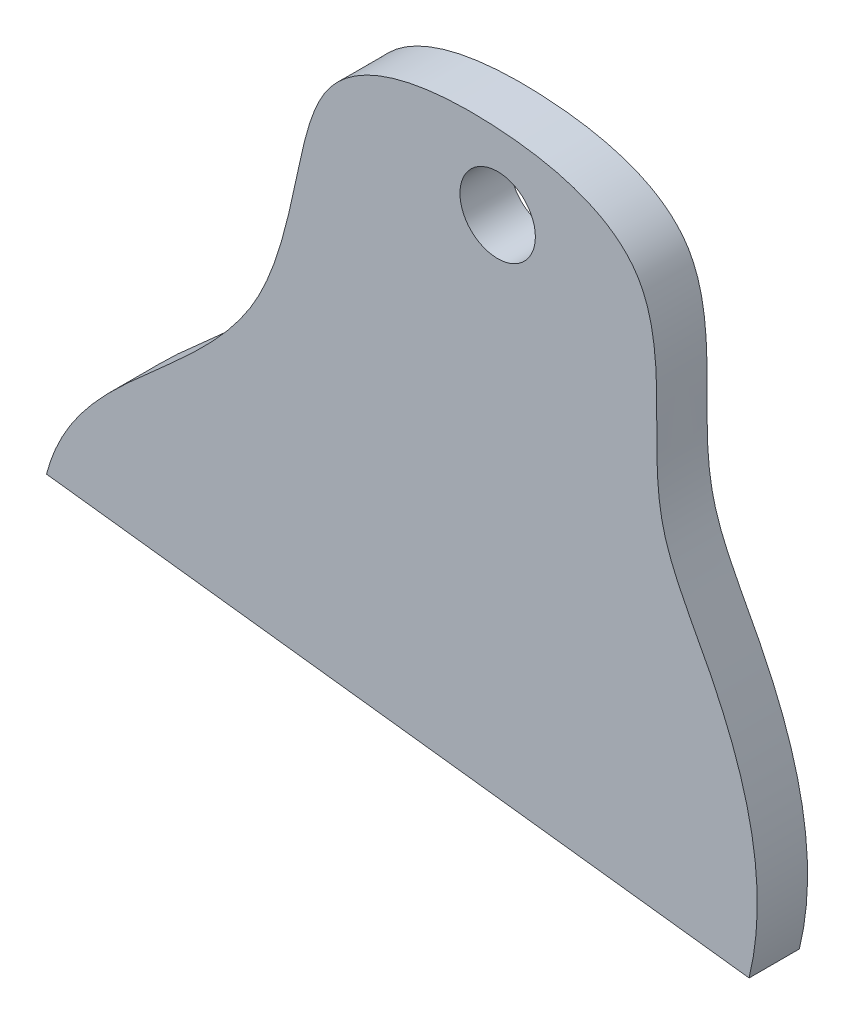
ISO-10303-21;
HEADER;
FILE_DESCRIPTION(('STEP AP214'),'2;1');
FILE_NAME('part.step','',(''),(''),'','','');
FILE_SCHEMA(('AUTOMOTIVE_DESIGN { 1 0 10303 214 1 1 1 1 }'));
ENDSEC;
DATA;
#1=APPLICATION_CONTEXT('core data for automotive mechanical design processes');
#2=APPLICATION_PROTOCOL_DEFINITION('international standard','automotive_design',2000,#1);
#3=PRODUCT_CONTEXT('',#1,'mechanical');
#4=PRODUCT('Part','Part','',(#3));
#5=PRODUCT_RELATED_PRODUCT_CATEGORY('part','',(#4));
#6=PRODUCT_DEFINITION_FORMATION('','',#4);
#7=PRODUCT_DEFINITION_CONTEXT('part definition',#1,'design');
#8=PRODUCT_DEFINITION('design','',#6,#7);
#9=PRODUCT_DEFINITION_SHAPE('','',#8);
#10=(LENGTH_UNIT() NAMED_UNIT(*) SI_UNIT(.MILLI.,.METRE.));
#11=(NAMED_UNIT(*) PLANE_ANGLE_UNIT() SI_UNIT($,.RADIAN.));
#12=(NAMED_UNIT(*) SI_UNIT($,.STERADIAN.) SOLID_ANGLE_UNIT());
#13=UNCERTAINTY_MEASURE_WITH_UNIT(LENGTH_MEASURE(1.E-05),#10,'distance_accuracy_value','');
#14=(GEOMETRIC_REPRESENTATION_CONTEXT(3) GLOBAL_UNCERTAINTY_ASSIGNED_CONTEXT((#13)) GLOBAL_UNIT_ASSIGNED_CONTEXT((#10,
#11,#12)) REPRESENTATION_CONTEXT('',''));
#15=CARTESIAN_POINT('',(0.,0.,0.));
#16=DIRECTION('',(0.,0.,1.));
#17=DIRECTION('',(1.,0.,0.));
#18=AXIS2_PLACEMENT_3D('',#15,#16,#17);
#19=CARTESIAN_POINT('',(196.885519600877,73.5197835961627,3.73352057061736));
#20=DIRECTION('',(0.,0.,1.));
#21=DIRECTION('',(1.,0.,0.));
#22=AXIS2_PLACEMENT_3D('',#19,#20,#21);
#23=PLANE('',#22);
#24=CARTESIAN_POINT('',(197.524201168025,68.7425599889752,3.73352057061736));
#25=DIRECTION('',(0.,0.,1.));
#26=DIRECTION('',(1.,0.,0.));
#27=AXIS2_PLACEMENT_3D('',#24,#25,#26);
#28=CIRCLE('',#27,2.38125);
#29=CARTESIAN_POINT('',(199.905451168025,68.7425599889752,3.73352057061736));
#30=VERTEX_POINT('',#29);
#31=EDGE_CURVE('E75',#30,#30,#28,.T.);
#32=ORIENTED_EDGE('',*,*,#31,.F.);
#33=EDGE_LOOP('',(#32));
#34=FACE_BOUND('',#33,.T.);
#35=CARTESIAN_POINT('',(213.398522317962,34.9678420457756,3.73352057061736));
#36=CARTESIAN_POINT('',(214.739425340125,40.5202417322655,3.73352057061736));
#37=CARTESIAN_POINT('',(212.727112535516,47.9078385286961,3.73352057061736));
#38=CARTESIAN_POINT('',(207.222282090085,56.7821358552539,3.73352057061736));
#39=CARTESIAN_POINT('',(207.778211380204,63.4368924721874,3.73352057061736));
#40=CARTESIAN_POINT('',(206.989400577675,71.7335959398961,3.73352057061736));
#41=CARTESIAN_POINT('',(196.992788874341,74.3612933869673,3.73352057061736));
#42=CARTESIAN_POINT('',(186.590416887325,72.7052604967253,3.73352057061736));
#43=CARTESIAN_POINT('',(184.658232764424,63.61418970115,3.73352057061736));
#44=CARTESIAN_POINT('',(183.082647038621,56.3219629705471,3.73352057061736));
#45=CARTESIAN_POINT('',(175.887019226226,49.0789156728427,3.73352057061736));
#46=CARTESIAN_POINT('',(170.220244557908,44.8785204542336,3.73352057061736));
#47=CARTESIAN_POINT('',(169.043801457843,40.3370977288428,3.73352057061736));
#48=B_SPLINE_CURVE_WITH_KNOTS('',3,(#35,#36,#37,#38,#39,#40,#41,#42,#43,#44,#45,#46,#47),
.UNSPECIFIED.,.F.,.F.,(4,1,1,1,1,1,1,1,1,1,4),(0.,0.174395650753758,0.246774344616884,
0.327814520097947,0.389778749260922,0.493993279713233,0.615527262475496,0.677077702508021,
0.775393493905345,0.855998922563102,1.),.UNSPECIFIED.);
#49=CARTESIAN_POINT('',(213.398522317962,34.9678420457756,3.73352057061736));
#50=VERTEX_POINT('',#49);
#51=CARTESIAN_POINT('',(169.043801457843,40.3370977288428,3.73352057061736));
#52=VERTEX_POINT('',#51);
#53=EDGE_CURVE('E67',#50,#52,#48,.T.);
#54=ORIENTED_EDGE('',*,*,#53,.T.);
#55=DIRECTION('',(0.992752683848461,-0.120175324886919,0.));
#56=VECTOR('',#55,1.);
#57=CARTESIAN_POINT('',(169.043801457843,40.3370977288428,3.73352057061736));
#58=LINE('',#57,#56);
#59=EDGE_CURVE('E52',#52,#50,#58,.T.);
#60=ORIENTED_EDGE('',*,*,#59,.T.);
#61=EDGE_LOOP('',(#54,#60));
#62=FACE_BOUND('',#61,.T.);
#63=ADVANCED_FACE('F35',(#34,#62),#23,.T.);
#64=CARTESIAN_POINT('',(196.885519600877,73.5197835961627,0.558520570975273));
#65=DIRECTION('',(0.,0.,1.));
#66=DIRECTION('',(1.,0.,0.));
#67=AXIS2_PLACEMENT_3D('',#64,#65,#66);
#68=PLANE('',#67);
#69=CARTESIAN_POINT('',(197.524201168025,68.7425599889752,0.558520570975273));
#70=DIRECTION('',(0.,0.,1.));
#71=DIRECTION('',(1.,0.,0.));
#72=AXIS2_PLACEMENT_3D('',#69,#70,#71);
#73=CIRCLE('',#72,2.38125);
#74=CARTESIAN_POINT('',(199.905451168025,68.7425599889752,0.558520570975273));
#75=VERTEX_POINT('',#74);
#76=EDGE_CURVE('E72',#75,#75,#73,.T.);
#77=ORIENTED_EDGE('',*,*,#76,.T.);
#78=EDGE_LOOP('',(#77));
#79=FACE_BOUND('',#78,.T.);
#80=CARTESIAN_POINT('',(213.398522317962,34.9678420457756,0.558520570975273));
#81=CARTESIAN_POINT('',(214.739425340125,40.5202417322655,0.558520570975273));
#82=CARTESIAN_POINT('',(212.727112535516,47.9078385286961,0.558520570975273));
#83=CARTESIAN_POINT('',(207.222282090085,56.7821358552539,0.558520570975273));
#84=CARTESIAN_POINT('',(207.778211380204,63.4368924721874,0.558520570975273));
#85=CARTESIAN_POINT('',(206.989400577675,71.7335959398961,0.558520570975273));
#86=CARTESIAN_POINT('',(196.992788874341,74.3612933869673,0.558520570975273));
#87=CARTESIAN_POINT('',(186.590416887325,72.7052604967253,0.558520570975273));
#88=CARTESIAN_POINT('',(184.658232764424,63.61418970115,0.558520570975273));
#89=CARTESIAN_POINT('',(183.082647038621,56.3219629705471,0.558520570975273));
#90=CARTESIAN_POINT('',(175.887019226226,49.0789156728427,0.558520570975273));
#91=CARTESIAN_POINT('',(170.220244557908,44.8785204542336,0.558520570975273));
#92=CARTESIAN_POINT('',(169.043801457843,40.3370977288428,0.558520570975273));
#93=B_SPLINE_CURVE_WITH_KNOTS('',3,(#80,#81,#82,#83,#84,#85,#86,#87,#88,#89,#90,#91,#92),
.UNSPECIFIED.,.F.,.F.,(4,1,1,1,1,1,1,1,1,1,4),(0.,0.174395650753758,0.246774344616884,
0.327814520097947,0.389778749260922,0.493993279713233,0.615527262475496,0.677077702508021,
0.775393493905345,0.855998922563102,1.),.UNSPECIFIED.);
#94=CARTESIAN_POINT('',(213.398522317962,34.9678420457756,0.558520570975273));
#95=VERTEX_POINT('',#94);
#96=CARTESIAN_POINT('',(169.043801457843,40.3370977288428,0.558520570975273));
#97=VERTEX_POINT('',#96);
#98=EDGE_CURVE('E68',#95,#97,#93,.T.);
#99=ORIENTED_EDGE('',*,*,#98,.F.);
#100=DIRECTION('',(0.992752683848461,-0.120175324886919,0.));
#101=VECTOR('',#100,1.);
#102=CARTESIAN_POINT('',(169.043801457843,40.3370977288428,0.558520570975273));
#103=LINE('',#102,#101);
#104=EDGE_CURVE('E60',#97,#95,#103,.T.);
#105=ORIENTED_EDGE('',*,*,#104,.F.);
#106=EDGE_LOOP('',(#99,#105));
#107=FACE_BOUND('',#106,.T.);
#108=ADVANCED_FACE('F71',(#79,#107),#68,.F.);
#109=DIRECTION('',(0.,0.,-1.));
#110=VECTOR('',#109,1.);
#111=SURFACE_OF_LINEAR_EXTRUSION('',#48,#110);
#112=ORIENTED_EDGE('',*,*,#98,.T.);
#113=DIRECTION('',(0.,0.,-1.));
#114=VECTOR('',#113,1.);
#115=CARTESIAN_POINT('',(169.043801457843,40.3370977288428,3.73352057061736));
#116=LINE('',#115,#114);
#117=EDGE_CURVE('E11',#52,#97,#116,.T.);
#118=ORIENTED_EDGE('',*,*,#117,.F.);
#119=ORIENTED_EDGE('',*,*,#53,.F.);
#120=DIRECTION('',(0.,0.,-1.));
#121=VECTOR('',#120,1.);
#122=CARTESIAN_POINT('',(213.398522317962,34.9678420457756,3.73352057061736));
#123=LINE('',#122,#121);
#124=EDGE_CURVE('E45',#50,#95,#123,.T.);
#125=ORIENTED_EDGE('',*,*,#124,.T.);
#126=EDGE_LOOP('',(#112,#118,#119,#125));
#127=FACE_BOUND('',#126,.T.);
#128=ADVANCED_FACE('F37',(#127),#111,.F.);
#129=CARTESIAN_POINT('',(169.043801457843,40.3370977288428,3.73352057061736));
#130=DIRECTION('',(0.120175324886919,0.992752683848462,0.));
#131=DIRECTION('',(-0.992752683848462,0.120175324886919,0.));
#132=AXIS2_PLACEMENT_3D('',#129,#130,#131);
#133=PLANE('',#132);
#134=ORIENTED_EDGE('',*,*,#104,.T.);
#135=ORIENTED_EDGE('',*,*,#124,.F.);
#136=ORIENTED_EDGE('',*,*,#59,.F.);
#137=ORIENTED_EDGE('',*,*,#117,.T.);
#138=EDGE_LOOP('',(#134,#135,#136,#137));
#139=FACE_BOUND('',#138,.T.);
#140=ADVANCED_FACE('F63',(#139),#133,.F.);
#141=CARTESIAN_POINT('',(197.524201168025,68.7425599889752,0.558520570975273));
#142=DIRECTION('',(0.,0.,1.));
#143=DIRECTION('',(1.,0.,0.));
#144=AXIS2_PLACEMENT_3D('',#141,#142,#143);
#145=CYLINDRICAL_SURFACE('',#144,2.38125);
#146=ORIENTED_EDGE('',*,*,#76,.F.);
#147=EDGE_LOOP('',(#146));
#148=FACE_BOUND('',#147,.T.);
#149=ORIENTED_EDGE('',*,*,#31,.T.);
#150=EDGE_LOOP('',(#149));
#151=FACE_BOUND('',#150,.T.);
#152=ADVANCED_FACE('F93',(#148,#151),#145,.F.);
#153=CLOSED_SHELL('',(#63,#108,#128,#140,#152));
#154=MANIFOLD_SOLID_BREP('B2',#153);
#155=ADVANCED_BREP_SHAPE_REPRESENTATION('',(#18,#154),#14);
#156=SHAPE_DEFINITION_REPRESENTATION(#9,#155);
ENDSEC;
END-ISO-10303-21;
